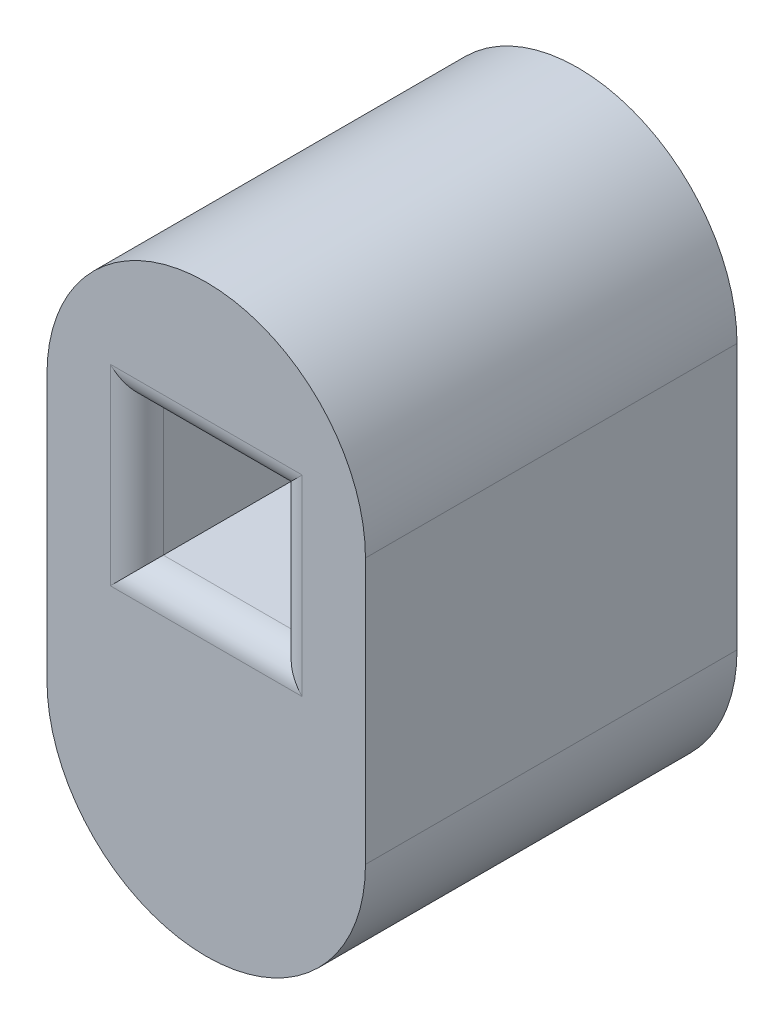
ISO-10303-21;
HEADER;
FILE_DESCRIPTION(('STEP AP214'),'2;1');
FILE_NAME('part.step','',(''),(''),'','','');
FILE_SCHEMA(('AUTOMOTIVE_DESIGN { 1 0 10303 214 1 1 1 1 }'));
ENDSEC;
DATA;
#1=APPLICATION_CONTEXT('core data for automotive mechanical design processes');
#2=APPLICATION_PROTOCOL_DEFINITION('international standard','automotive_design',2000,#1);
#3=PRODUCT_CONTEXT('',#1,'mechanical');
#4=PRODUCT('Part','Part','',(#3));
#5=PRODUCT_RELATED_PRODUCT_CATEGORY('part','',(#4));
#6=PRODUCT_DEFINITION_FORMATION('','',#4);
#7=PRODUCT_DEFINITION_CONTEXT('part definition',#1,'design');
#8=PRODUCT_DEFINITION('design','',#6,#7);
#9=PRODUCT_DEFINITION_SHAPE('','',#8);
#10=(LENGTH_UNIT() NAMED_UNIT(*) SI_UNIT(.MILLI.,.METRE.));
#11=(NAMED_UNIT(*) PLANE_ANGLE_UNIT() SI_UNIT($,.RADIAN.));
#12=(NAMED_UNIT(*) SI_UNIT($,.STERADIAN.) SOLID_ANGLE_UNIT());
#13=UNCERTAINTY_MEASURE_WITH_UNIT(LENGTH_MEASURE(1.E-05),#10,'distance_accuracy_value','');
#14=(GEOMETRIC_REPRESENTATION_CONTEXT(3) GLOBAL_UNCERTAINTY_ASSIGNED_CONTEXT((#13)) GLOBAL_UNIT_ASSIGNED_CONTEXT((#10,
#11,#12)) REPRESENTATION_CONTEXT('',''));
#15=CARTESIAN_POINT('',(0.,0.,0.));
#16=DIRECTION('',(0.,0.,1.));
#17=DIRECTION('',(1.,0.,0.));
#18=AXIS2_PLACEMENT_3D('',#15,#16,#17);
#19=CARTESIAN_POINT('',(0.,0.,14.));
#20=DIRECTION('',(0.,0.,1.));
#21=DIRECTION('',(1.,0.,0.));
#22=AXIS2_PLACEMENT_3D('',#19,#20,#21);
#23=PLANE('',#22);
#24=DIRECTION('',(0.,1.,0.));
#25=VECTOR('',#24,1.);
#26=CARTESIAN_POINT('',(3.615,0.,14.));
#27=LINE('',#26,#25);
#28=CARTESIAN_POINT('',(3.615,11.515,14.));
#29=VERTEX_POINT('',#28);
#30=CARTESIAN_POINT('',(3.615,4.285,14.));
#31=VERTEX_POINT('',#30);
#32=EDGE_CURVE('E157',#29,#31,#27,.F.);
#33=ORIENTED_EDGE('',*,*,#32,.T.);
#34=DIRECTION('',(1.,0.,0.));
#35=VECTOR('',#34,1.);
#36=CARTESIAN_POINT('',(0.,4.285,14.));
#37=LINE('',#36,#35);
#38=CARTESIAN_POINT('',(-3.615,4.285,14.));
#39=VERTEX_POINT('',#38);
#40=EDGE_CURVE('E168',#31,#39,#37,.F.);
#41=ORIENTED_EDGE('',*,*,#40,.T.);
#42=DIRECTION('',(0.,-1.,0.));
#43=VECTOR('',#42,1.);
#44=CARTESIAN_POINT('',(-3.615,0.,14.));
#45=LINE('',#44,#43);
#46=CARTESIAN_POINT('',(-3.615,11.515,14.));
#47=VERTEX_POINT('',#46);
#48=EDGE_CURVE('E166',#39,#47,#45,.F.);
#49=ORIENTED_EDGE('',*,*,#48,.T.);
#50=DIRECTION('',(-1.,0.,0.));
#51=VECTOR('',#50,1.);
#52=CARTESIAN_POINT('',(0.,11.515,14.));
#53=LINE('',#52,#51);
#54=EDGE_CURVE('E164',#47,#29,#53,.F.);
#55=ORIENTED_EDGE('',*,*,#54,.T.);
#56=EDGE_LOOP('',(#33,#41,#49,#55));
#57=FACE_BOUND('',#56,.T.);
#58=CARTESIAN_POINT('',(0.,0.,14.));
#59=DIRECTION('',(0.,0.,1.));
#60=DIRECTION('',(1.,0.,0.));
#61=AXIS2_PLACEMENT_3D('',#58,#59,#60);
#62=CIRCLE('',#61,6.);
#63=CARTESIAN_POINT('',(-6.,0.,14.));
#64=VERTEX_POINT('',#63);
#65=CARTESIAN_POINT('',(6.,0.,14.));
#66=VERTEX_POINT('',#65);
#67=EDGE_CURVE('E141',#64,#66,#62,.T.);
#68=ORIENTED_EDGE('',*,*,#67,.T.);
#69=DIRECTION('',(0.,1.,0.));
#70=VECTOR('',#69,1.);
#71=CARTESIAN_POINT('',(6.,0.,14.));
#72=LINE('',#71,#70);
#73=CARTESIAN_POINT('',(6.,10.,14.));
#74=VERTEX_POINT('',#73);
#75=EDGE_CURVE('E130',#66,#74,#72,.T.);
#76=ORIENTED_EDGE('',*,*,#75,.T.);
#77=CARTESIAN_POINT('',(0.,10.,14.));
#78=DIRECTION('',(0.,0.,1.));
#79=DIRECTION('',(1.,0.,0.));
#80=AXIS2_PLACEMENT_3D('',#77,#78,#79);
#81=CIRCLE('',#80,6.);
#82=CARTESIAN_POINT('',(-6.,10.,14.));
#83=VERTEX_POINT('',#82);
#84=EDGE_CURVE('E140',#74,#83,#81,.T.);
#85=ORIENTED_EDGE('',*,*,#84,.T.);
#86=DIRECTION('',(0.,-1.,0.));
#87=VECTOR('',#86,1.);
#88=CARTESIAN_POINT('',(-6.,0.,14.));
#89=LINE('',#88,#87);
#90=EDGE_CURVE('E145',#83,#64,#89,.T.);
#91=ORIENTED_EDGE('',*,*,#90,.T.);
#92=EDGE_LOOP('',(#68,#76,#85,#91));
#93=FACE_BOUND('',#92,.T.);
#94=ADVANCED_FACE('F39',(#57,#93),#23,.T.);
#95=CARTESIAN_POINT('',(0.,0.,0.));
#96=DIRECTION('',(0.,0.,1.));
#97=DIRECTION('',(1.,0.,0.));
#98=AXIS2_PLACEMENT_3D('',#95,#96,#97);
#99=PLANE('',#98);
#100=DIRECTION('',(-1.,0.,0.));
#101=VECTOR('',#100,1.);
#102=CARTESIAN_POINT('',(-2.615,11.515,0.));
#103=LINE('',#102,#101);
#104=CARTESIAN_POINT('',(3.615,11.515,0.));
#105=VERTEX_POINT('',#104);
#106=CARTESIAN_POINT('',(-3.615,11.515,0.));
#107=VERTEX_POINT('',#106);
#108=EDGE_CURVE('E177',#105,#107,#103,.T.);
#109=ORIENTED_EDGE('',*,*,#108,.T.);
#110=DIRECTION('',(0.,-1.,0.));
#111=VECTOR('',#110,1.);
#112=CARTESIAN_POINT('',(-3.615,5.285,0.));
#113=LINE('',#112,#111);
#114=CARTESIAN_POINT('',(-3.615,4.285,0.));
#115=VERTEX_POINT('',#114);
#116=EDGE_CURVE('E194',#107,#115,#113,.T.);
#117=ORIENTED_EDGE('',*,*,#116,.T.);
#118=DIRECTION('',(1.,0.,0.));
#119=VECTOR('',#118,1.);
#120=CARTESIAN_POINT('',(2.615,4.285,0.));
#121=LINE('',#120,#119);
#122=CARTESIAN_POINT('',(3.615,4.285,0.));
#123=VERTEX_POINT('',#122);
#124=EDGE_CURVE('E192',#115,#123,#121,.T.);
#125=ORIENTED_EDGE('',*,*,#124,.T.);
#126=DIRECTION('',(0.,1.,0.));
#127=VECTOR('',#126,1.);
#128=CARTESIAN_POINT('',(3.615,10.515,0.));
#129=LINE('',#128,#127);
#130=EDGE_CURVE('E190',#123,#105,#129,.T.);
#131=ORIENTED_EDGE('',*,*,#130,.T.);
#132=EDGE_LOOP('',(#109,#117,#125,#131));
#133=FACE_BOUND('',#132,.T.);
#134=CARTESIAN_POINT('',(0.,0.,0.));
#135=DIRECTION('',(0.,0.,1.));
#136=DIRECTION('',(1.,0.,0.));
#137=AXIS2_PLACEMENT_3D('',#134,#135,#136);
#138=CIRCLE('',#137,6.);
#139=CARTESIAN_POINT('',(-6.,0.,0.));
#140=VERTEX_POINT('',#139);
#141=CARTESIAN_POINT('',(6.,0.,0.));
#142=VERTEX_POINT('',#141);
#143=EDGE_CURVE('E153',#140,#142,#138,.T.);
#144=ORIENTED_EDGE('',*,*,#143,.F.);
#145=DIRECTION('',(0.,-1.,0.));
#146=VECTOR('',#145,1.);
#147=CARTESIAN_POINT('',(-6.,0.,0.));
#148=LINE('',#147,#146);
#149=CARTESIAN_POINT('',(-6.,10.,0.));
#150=VERTEX_POINT('',#149);
#151=EDGE_CURVE('E149',#150,#140,#148,.T.);
#152=ORIENTED_EDGE('',*,*,#151,.F.);
#153=CARTESIAN_POINT('',(0.,10.,0.));
#154=DIRECTION('',(0.,0.,1.));
#155=DIRECTION('',(1.,0.,0.));
#156=AXIS2_PLACEMENT_3D('',#153,#154,#155);
#157=CIRCLE('',#156,6.);
#158=CARTESIAN_POINT('',(6.,10.,0.));
#159=VERTEX_POINT('',#158);
#160=EDGE_CURVE('E248',#159,#150,#157,.T.);
#161=ORIENTED_EDGE('',*,*,#160,.F.);
#162=DIRECTION('',(0.,1.,0.));
#163=VECTOR('',#162,1.);
#164=CARTESIAN_POINT('',(6.,0.,0.));
#165=LINE('',#164,#163);
#166=EDGE_CURVE('E245',#142,#159,#165,.T.);
#167=ORIENTED_EDGE('',*,*,#166,.F.);
#168=EDGE_LOOP('',(#144,#152,#161,#167));
#169=FACE_BOUND('',#168,.T.);
#170=ADVANCED_FACE('F239',(#133,#169),#99,.F.);
#171=CARTESIAN_POINT('',(0.,0.,14.));
#172=DIRECTION('',(0.,0.,-1.));
#173=DIRECTION('',(-1.,0.,0.));
#174=AXIS2_PLACEMENT_3D('',#171,#172,#173);
#175=CYLINDRICAL_SURFACE('',#174,6.);
#176=ORIENTED_EDGE('',*,*,#143,.T.);
#177=DIRECTION('',(0.,0.,-1.));
#178=VECTOR('',#177,1.);
#179=CARTESIAN_POINT('',(6.,0.,14.));
#180=LINE('',#179,#178);
#181=EDGE_CURVE('E134',#66,#142,#180,.T.);
#182=ORIENTED_EDGE('',*,*,#181,.F.);
#183=ORIENTED_EDGE('',*,*,#67,.F.);
#184=DIRECTION('',(0.,0.,-1.));
#185=VECTOR('',#184,1.);
#186=CARTESIAN_POINT('',(-6.,0.,14.));
#187=LINE('',#186,#185);
#188=EDGE_CURVE('E256',#64,#140,#187,.T.);
#189=ORIENTED_EDGE('',*,*,#188,.T.);
#190=EDGE_LOOP('',(#176,#182,#183,#189));
#191=FACE_BOUND('',#190,.T.);
#192=ADVANCED_FACE('F151',(#191),#175,.T.);
#193=CARTESIAN_POINT('',(6.,0.,14.));
#194=DIRECTION('',(-1.,0.,0.));
#195=DIRECTION('',(0.,0.,1.));
#196=AXIS2_PLACEMENT_3D('',#193,#194,#195);
#197=PLANE('',#196);
#198=ORIENTED_EDGE('',*,*,#166,.T.);
#199=DIRECTION('',(0.,0.,-1.));
#200=VECTOR('',#199,1.);
#201=CARTESIAN_POINT('',(6.,10.,14.));
#202=LINE('',#201,#200);
#203=EDGE_CURVE('E137',#74,#159,#202,.T.);
#204=ORIENTED_EDGE('',*,*,#203,.F.);
#205=ORIENTED_EDGE('',*,*,#75,.F.);
#206=ORIENTED_EDGE('',*,*,#181,.T.);
#207=EDGE_LOOP('',(#198,#204,#205,#206));
#208=FACE_BOUND('',#207,.T.);
#209=ADVANCED_FACE('F132',(#208),#197,.F.);
#210=CARTESIAN_POINT('',(0.,10.,14.));
#211=DIRECTION('',(0.,0.,-1.));
#212=DIRECTION('',(-1.,0.,0.));
#213=AXIS2_PLACEMENT_3D('',#210,#211,#212);
#214=CYLINDRICAL_SURFACE('',#213,6.);
#215=ORIENTED_EDGE('',*,*,#160,.T.);
#216=DIRECTION('',(0.,0.,-1.));
#217=VECTOR('',#216,1.);
#218=CARTESIAN_POINT('',(-6.,10.,14.));
#219=LINE('',#218,#217);
#220=EDGE_CURVE('E159',#83,#150,#219,.T.);
#221=ORIENTED_EDGE('',*,*,#220,.F.);
#222=ORIENTED_EDGE('',*,*,#84,.F.);
#223=ORIENTED_EDGE('',*,*,#203,.T.);
#224=EDGE_LOOP('',(#215,#221,#222,#223));
#225=FACE_BOUND('',#224,.T.);
#226=ADVANCED_FACE('F262',(#225),#214,.T.);
#227=CARTESIAN_POINT('',(-6.,0.,14.));
#228=DIRECTION('',(1.,0.,0.));
#229=DIRECTION('',(0.,0.,-1.));
#230=AXIS2_PLACEMENT_3D('',#227,#228,#229);
#231=PLANE('',#230);
#232=ORIENTED_EDGE('',*,*,#151,.T.);
#233=ORIENTED_EDGE('',*,*,#188,.F.);
#234=ORIENTED_EDGE('',*,*,#90,.F.);
#235=ORIENTED_EDGE('',*,*,#220,.T.);
#236=EDGE_LOOP('',(#232,#233,#234,#235));
#237=FACE_BOUND('',#236,.T.);
#238=ADVANCED_FACE('F260',(#237),#231,.F.);
#239=CARTESIAN_POINT('',(2.615,5.285,14.));
#240=DIRECTION('',(-1.,0.,0.));
#241=DIRECTION('',(0.,0.,1.));
#242=AXIS2_PLACEMENT_3D('',#239,#240,#241);
#243=PLANE('',#242);
#244=DIRECTION('',(0.,0.,-1.));
#245=VECTOR('',#244,1.);
#246=CARTESIAN_POINT('',(2.615,10.515,14.));
#247=LINE('',#246,#245);
#248=CARTESIAN_POINT('',(2.615,10.515,13.));
#249=VERTEX_POINT('',#248);
#250=CARTESIAN_POINT('',(2.615,10.515,0.999999999999999));
#251=VERTEX_POINT('',#250);
#252=EDGE_CURVE('E246',#249,#251,#247,.T.);
#253=ORIENTED_EDGE('',*,*,#252,.T.);
#254=DIRECTION('',(0.,1.,0.));
#255=VECTOR('',#254,1.);
#256=CARTESIAN_POINT('',(2.615,5.285,1.));
#257=LINE('',#256,#255);
#258=CARTESIAN_POINT('',(2.615,5.285,0.999999999999999));
#259=VERTEX_POINT('',#258);
#260=EDGE_CURVE('E48',#251,#259,#257,.F.);
#261=ORIENTED_EDGE('',*,*,#260,.T.);
#262=DIRECTION('',(0.,0.,-1.));
#263=VECTOR('',#262,1.);
#264=CARTESIAN_POINT('',(2.615,5.285,14.));
#265=LINE('',#264,#263);
#266=CARTESIAN_POINT('',(2.615,5.285,13.));
#267=VERTEX_POINT('',#266);
#268=EDGE_CURVE('E188',#267,#259,#265,.T.);
#269=ORIENTED_EDGE('',*,*,#268,.F.);
#270=DIRECTION('',(0.,1.,0.));
#271=VECTOR('',#270,1.);
#272=CARTESIAN_POINT('',(2.615,5.285,13.));
#273=LINE('',#272,#271);
#274=EDGE_CURVE('E175',#267,#249,#273,.T.);
#275=ORIENTED_EDGE('',*,*,#274,.T.);
#276=EDGE_LOOP('',(#253,#261,#269,#275));
#277=FACE_BOUND('',#276,.T.);
#278=ADVANCED_FACE('F281',(#277),#243,.T.);
#279=CARTESIAN_POINT('',(-2.615,10.515,14.));
#280=DIRECTION('',(0.,-1.,0.));
#281=DIRECTION('',(0.,0.,-1.));
#282=AXIS2_PLACEMENT_3D('',#279,#280,#281);
#283=PLANE('',#282);
#284=DIRECTION('',(0.,0.,-1.));
#285=VECTOR('',#284,1.);
#286=CARTESIAN_POINT('',(-2.615,10.515,14.));
#287=LINE('',#286,#285);
#288=CARTESIAN_POINT('',(-2.615,10.515,13.));
#289=VERTEX_POINT('',#288);
#290=CARTESIAN_POINT('',(-2.615,10.515,0.999999999999999));
#291=VERTEX_POINT('',#290);
#292=EDGE_CURVE('E233',#289,#291,#287,.T.);
#293=ORIENTED_EDGE('',*,*,#292,.T.);
#294=DIRECTION('',(-1.,0.,0.));
#295=VECTOR('',#294,1.);
#296=CARTESIAN_POINT('',(2.615,10.515,1.));
#297=LINE('',#296,#295);
#298=EDGE_CURVE('E11',#291,#251,#297,.F.);
#299=ORIENTED_EDGE('',*,*,#298,.T.);
#300=ORIENTED_EDGE('',*,*,#252,.F.);
#301=DIRECTION('',(-1.,0.,0.));
#302=VECTOR('',#301,1.);
#303=CARTESIAN_POINT('',(-2.615,10.515,13.));
#304=LINE('',#303,#302);
#305=EDGE_CURVE('E173',#249,#289,#304,.T.);
#306=ORIENTED_EDGE('',*,*,#305,.T.);
#307=EDGE_LOOP('',(#293,#299,#300,#306));
#308=FACE_BOUND('',#307,.T.);
#309=ADVANCED_FACE('F265',(#308),#283,.T.);
#310=CARTESIAN_POINT('',(-2.615,5.285,14.));
#311=DIRECTION('',(1.,0.,0.));
#312=DIRECTION('',(0.,0.,-1.));
#313=AXIS2_PLACEMENT_3D('',#310,#311,#312);
#314=PLANE('',#313);
#315=DIRECTION('',(0.,0.,-1.));
#316=VECTOR('',#315,1.);
#317=CARTESIAN_POINT('',(-2.615,5.285,14.));
#318=LINE('',#317,#316);
#319=CARTESIAN_POINT('',(-2.615,5.285,13.));
#320=VERTEX_POINT('',#319);
#321=CARTESIAN_POINT('',(-2.615,5.285,0.999999999999999));
#322=VERTEX_POINT('',#321);
#323=EDGE_CURVE('E226',#320,#322,#318,.T.);
#324=ORIENTED_EDGE('',*,*,#323,.T.);
#325=DIRECTION('',(0.,-1.,0.));
#326=VECTOR('',#325,1.);
#327=CARTESIAN_POINT('',(-2.615,10.515,1.));
#328=LINE('',#327,#326);
#329=EDGE_CURVE('E197',#322,#291,#328,.F.);
#330=ORIENTED_EDGE('',*,*,#329,.T.);
#331=ORIENTED_EDGE('',*,*,#292,.F.);
#332=DIRECTION('',(0.,-1.,0.));
#333=VECTOR('',#332,1.);
#334=CARTESIAN_POINT('',(-2.615,5.285,13.));
#335=LINE('',#334,#333);
#336=EDGE_CURVE('E171',#289,#320,#335,.T.);
#337=ORIENTED_EDGE('',*,*,#336,.T.);
#338=EDGE_LOOP('',(#324,#330,#331,#337));
#339=FACE_BOUND('',#338,.T.);
#340=ADVANCED_FACE('F230',(#339),#314,.T.);
#341=CARTESIAN_POINT('',(-2.615,5.285,14.));
#342=DIRECTION('',(0.,1.,0.));
#343=DIRECTION('',(0.,0.,1.));
#344=AXIS2_PLACEMENT_3D('',#341,#342,#343);
#345=PLANE('',#344);
#346=ORIENTED_EDGE('',*,*,#268,.T.);
#347=DIRECTION('',(1.,0.,0.));
#348=VECTOR('',#347,1.);
#349=CARTESIAN_POINT('',(-2.615,5.285,1.));
#350=LINE('',#349,#348);
#351=EDGE_CURVE('E200',#259,#322,#350,.F.);
#352=ORIENTED_EDGE('',*,*,#351,.T.);
#353=ORIENTED_EDGE('',*,*,#323,.F.);
#354=DIRECTION('',(1.,0.,0.));
#355=VECTOR('',#354,1.);
#356=CARTESIAN_POINT('',(-2.615,5.285,13.));
#357=LINE('',#356,#355);
#358=EDGE_CURVE('E154',#320,#267,#357,.T.);
#359=ORIENTED_EDGE('',*,*,#358,.T.);
#360=EDGE_LOOP('',(#346,#352,#353,#359));
#361=FACE_BOUND('',#360,.T.);
#362=ADVANCED_FACE('F225',(#361),#345,.T.);
#363=CARTESIAN_POINT('',(-2.615,11.515,13.));
#364=DIRECTION('',(-1.,0.,0.));
#365=DIRECTION('',(0.,0.,1.));
#366=AXIS2_PLACEMENT_3D('',#363,#364,#365);
#367=CYLINDRICAL_SURFACE('',#366,1.);
#368=CARTESIAN_POINT('',(3.615,11.515,13.));
#369=DIRECTION('',(-0.707106781186547,0.707106781186547,0.));
#370=DIRECTION('',(-0.707106781186547,-0.707106781186547,0.));
#371=AXIS2_PLACEMENT_3D('',#368,#369,#370);
#372=ELLIPSE('',#371,1.41421356237309,1.);
#373=EDGE_CURVE('E182',#29,#249,#372,.F.);
#374=ORIENTED_EDGE('',*,*,#373,.F.);
#375=ORIENTED_EDGE('',*,*,#54,.F.);
#376=CARTESIAN_POINT('',(-3.615,11.515,13.));
#377=DIRECTION('',(-0.707106781186547,-0.707106781186547,0.));
#378=DIRECTION('',(0.707106781186547,-0.707106781186547,0.));
#379=AXIS2_PLACEMENT_3D('',#376,#377,#378);
#380=ELLIPSE('',#379,1.41421356237309,1.);
#381=EDGE_CURVE('E185',#289,#47,#380,.T.);
#382=ORIENTED_EDGE('',*,*,#381,.F.);
#383=ORIENTED_EDGE('',*,*,#305,.F.);
#384=EDGE_LOOP('',(#374,#375,#382,#383));
#385=FACE_BOUND('',#384,.T.);
#386=ADVANCED_FACE('F271',(#385),#367,.T.);
#387=CARTESIAN_POINT('',(-3.615,5.285,13.));
#388=DIRECTION('',(0.,-1.,0.));
#389=DIRECTION('',(0.,0.,-1.));
#390=AXIS2_PLACEMENT_3D('',#387,#388,#389);
#391=CYLINDRICAL_SURFACE('',#390,1.);
#392=ORIENTED_EDGE('',*,*,#381,.T.);
#393=ORIENTED_EDGE('',*,*,#48,.F.);
#394=CARTESIAN_POINT('',(-3.615,4.285,13.));
#395=DIRECTION('',(0.707106781186547,-0.707106781186547,0.));
#396=DIRECTION('',(0.707106781186547,0.707106781186547,0.));
#397=AXIS2_PLACEMENT_3D('',#394,#395,#396);
#398=ELLIPSE('',#397,1.41421356237309,1.);
#399=EDGE_CURVE('E180',#320,#39,#398,.T.);
#400=ORIENTED_EDGE('',*,*,#399,.F.);
#401=ORIENTED_EDGE('',*,*,#336,.F.);
#402=EDGE_LOOP('',(#392,#393,#400,#401));
#403=FACE_BOUND('',#402,.T.);
#404=ADVANCED_FACE('F274',(#403),#391,.T.);
#405=CARTESIAN_POINT('',(3.615,5.285,13.));
#406=DIRECTION('',(0.,1.,0.));
#407=DIRECTION('',(0.,0.,1.));
#408=AXIS2_PLACEMENT_3D('',#405,#406,#407);
#409=CYLINDRICAL_SURFACE('',#408,1.);
#410=ORIENTED_EDGE('',*,*,#373,.T.);
#411=ORIENTED_EDGE('',*,*,#274,.F.);
#412=CARTESIAN_POINT('',(3.615,4.285,13.));
#413=DIRECTION('',(0.707106781186547,0.707106781186547,0.));
#414=DIRECTION('',(0.707106781186547,-0.707106781186547,0.));
#415=AXIS2_PLACEMENT_3D('',#412,#413,#414);
#416=ELLIPSE('',#415,1.41421356237309,1.);
#417=EDGE_CURVE('E178',#31,#267,#416,.F.);
#418=ORIENTED_EDGE('',*,*,#417,.F.);
#419=ORIENTED_EDGE('',*,*,#32,.F.);
#420=EDGE_LOOP('',(#410,#411,#418,#419));
#421=FACE_BOUND('',#420,.T.);
#422=ADVANCED_FACE('F283',(#421),#409,.T.);
#423=CARTESIAN_POINT('',(-2.615,4.285,13.));
#424=DIRECTION('',(1.,0.,0.));
#425=DIRECTION('',(0.,0.,-1.));
#426=AXIS2_PLACEMENT_3D('',#423,#424,#425);
#427=CYLINDRICAL_SURFACE('',#426,1.);
#428=ORIENTED_EDGE('',*,*,#399,.T.);
#429=ORIENTED_EDGE('',*,*,#40,.F.);
#430=ORIENTED_EDGE('',*,*,#417,.T.);
#431=ORIENTED_EDGE('',*,*,#358,.F.);
#432=EDGE_LOOP('',(#428,#429,#430,#431));
#433=FACE_BOUND('',#432,.T.);
#434=ADVANCED_FACE('F278',(#433),#427,.T.);
#435=CARTESIAN_POINT('',(3.615,0.,1.));
#436=DIRECTION('',(0.,-1.,0.));
#437=DIRECTION('',(0.,0.,-1.));
#438=AXIS2_PLACEMENT_3D('',#435,#436,#437);
#439=CYLINDRICAL_SURFACE('',#438,1.);
#440=CARTESIAN_POINT('',(3.615,4.285,1.));
#441=DIRECTION('',(-0.707106781186547,-0.707106781186547,0.));
#442=DIRECTION('',(-0.707106781186547,0.707106781186547,0.));
#443=AXIS2_PLACEMENT_3D('',#440,#441,#442);
#444=ELLIPSE('',#443,1.41421356237309,1.);
#445=EDGE_CURVE('E206',#259,#123,#444,.T.);
#446=ORIENTED_EDGE('',*,*,#445,.F.);
#447=ORIENTED_EDGE('',*,*,#260,.F.);
#448=CARTESIAN_POINT('',(3.615,11.515,1.));
#449=DIRECTION('',(0.707106781186547,-0.707106781186547,0.));
#450=DIRECTION('',(-0.707106781186547,-0.707106781186547,0.));
#451=AXIS2_PLACEMENT_3D('',#448,#449,#450);
#452=ELLIPSE('',#451,1.41421356237309,1.);
#453=EDGE_CURVE('E43',#105,#251,#452,.F.);
#454=ORIENTED_EDGE('',*,*,#453,.F.);
#455=ORIENTED_EDGE('',*,*,#130,.F.);
#456=EDGE_LOOP('',(#446,#447,#454,#455));
#457=FACE_BOUND('',#456,.T.);
#458=ADVANCED_FACE('F41',(#457),#439,.T.);
#459=CARTESIAN_POINT('',(0.,11.515,1.));
#460=DIRECTION('',(1.,0.,0.));
#461=DIRECTION('',(0.,0.,-1.));
#462=AXIS2_PLACEMENT_3D('',#459,#460,#461);
#463=CYLINDRICAL_SURFACE('',#462,1.);
#464=ORIENTED_EDGE('',*,*,#453,.T.);
#465=ORIENTED_EDGE('',*,*,#298,.F.);
#466=CARTESIAN_POINT('',(-3.615,11.515,1.));
#467=DIRECTION('',(0.707106781186547,0.707106781186547,0.));
#468=DIRECTION('',(-0.707106781186547,0.707106781186547,0.));
#469=AXIS2_PLACEMENT_3D('',#466,#467,#468);
#470=ELLIPSE('',#469,1.41421356237309,1.);
#471=EDGE_CURVE('E205',#107,#291,#470,.F.);
#472=ORIENTED_EDGE('',*,*,#471,.F.);
#473=ORIENTED_EDGE('',*,*,#108,.F.);
#474=EDGE_LOOP('',(#464,#465,#472,#473));
#475=FACE_BOUND('',#474,.T.);
#476=ADVANCED_FACE('F216',(#475),#463,.T.);
#477=CARTESIAN_POINT('',(0.,4.285,1.));
#478=DIRECTION('',(-1.,0.,0.));
#479=DIRECTION('',(0.,0.,1.));
#480=AXIS2_PLACEMENT_3D('',#477,#478,#479);
#481=CYLINDRICAL_SURFACE('',#480,1.);
#482=ORIENTED_EDGE('',*,*,#445,.T.);
#483=ORIENTED_EDGE('',*,*,#124,.F.);
#484=CARTESIAN_POINT('',(-3.615,4.285,1.));
#485=DIRECTION('',(-0.707106781186547,0.707106781186547,0.));
#486=DIRECTION('',(0.707106781186547,0.707106781186547,0.));
#487=AXIS2_PLACEMENT_3D('',#484,#485,#486);
#488=ELLIPSE('',#487,1.41421356237309,1.);
#489=EDGE_CURVE('E203',#322,#115,#488,.T.);
#490=ORIENTED_EDGE('',*,*,#489,.F.);
#491=ORIENTED_EDGE('',*,*,#351,.F.);
#492=EDGE_LOOP('',(#482,#483,#490,#491));
#493=FACE_BOUND('',#492,.T.);
#494=ADVANCED_FACE('F221',(#493),#481,.T.);
#495=CARTESIAN_POINT('',(-3.615,0.,1.));
#496=DIRECTION('',(0.,1.,0.));
#497=DIRECTION('',(0.,0.,1.));
#498=AXIS2_PLACEMENT_3D('',#495,#496,#497);
#499=CYLINDRICAL_SURFACE('',#498,1.);
#500=ORIENTED_EDGE('',*,*,#471,.T.);
#501=ORIENTED_EDGE('',*,*,#329,.F.);
#502=ORIENTED_EDGE('',*,*,#489,.T.);
#503=ORIENTED_EDGE('',*,*,#116,.F.);
#504=EDGE_LOOP('',(#500,#501,#502,#503));
#505=FACE_BOUND('',#504,.T.);
#506=ADVANCED_FACE('F236',(#505),#499,.T.);
#507=CLOSED_SHELL('',(#94,#170,#192,#209,#226,#238,#278,#309,#340,#362,#386,#404,#422,#434,#458,
#476,#494,#506));
#508=MANIFOLD_SOLID_BREP('B2',#507);
#509=ADVANCED_BREP_SHAPE_REPRESENTATION('',(#18,#508),#14);
#510=SHAPE_DEFINITION_REPRESENTATION(#9,#509);
ENDSEC;
END-ISO-10303-21;
